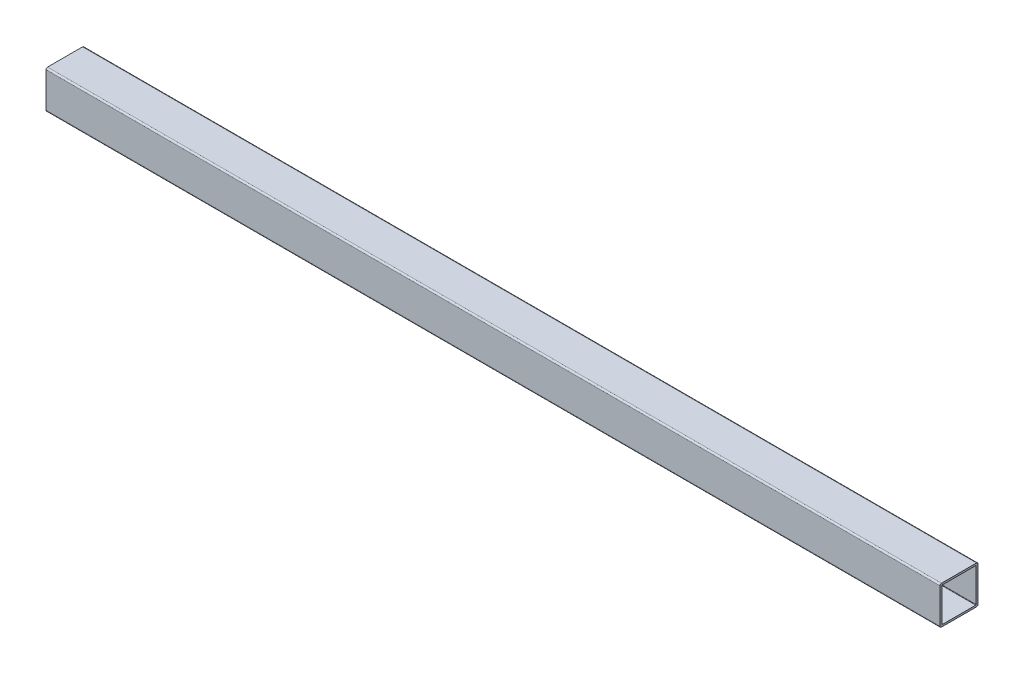
ISO-10303-21;
HEADER;
FILE_DESCRIPTION(('STEP AP214'),'2;1');
FILE_NAME('part.step','',(''),(''),'','','');
FILE_SCHEMA(('AUTOMOTIVE_DESIGN { 1 0 10303 214 1 1 1 1 }'));
ENDSEC;
DATA;
#1=APPLICATION_CONTEXT('core data for automotive mechanical design processes');
#2=APPLICATION_PROTOCOL_DEFINITION('international standard','automotive_design',2000,#1);
#3=PRODUCT_CONTEXT('',#1,'mechanical');
#4=PRODUCT('Part','Part','',(#3));
#5=PRODUCT_RELATED_PRODUCT_CATEGORY('part','',(#4));
#6=PRODUCT_DEFINITION_FORMATION('','',#4);
#7=PRODUCT_DEFINITION_CONTEXT('part definition',#1,'design');
#8=PRODUCT_DEFINITION('design','',#6,#7);
#9=PRODUCT_DEFINITION_SHAPE('','',#8);
#10=(LENGTH_UNIT() NAMED_UNIT(*) SI_UNIT(.MILLI.,.METRE.));
#11=(NAMED_UNIT(*) PLANE_ANGLE_UNIT() SI_UNIT($,.RADIAN.));
#12=(NAMED_UNIT(*) SI_UNIT($,.STERADIAN.) SOLID_ANGLE_UNIT());
#13=UNCERTAINTY_MEASURE_WITH_UNIT(LENGTH_MEASURE(1.E-05),#10,'distance_accuracy_value','');
#14=(GEOMETRIC_REPRESENTATION_CONTEXT(3) GLOBAL_UNCERTAINTY_ASSIGNED_CONTEXT((#13)) GLOBAL_UNIT_ASSIGNED_CONTEXT((#10,
#11,#12)) REPRESENTATION_CONTEXT('',''));
#15=CARTESIAN_POINT('',(0.,0.,0.));
#16=DIRECTION('',(0.,0.,1.));
#17=DIRECTION('',(1.,0.,0.));
#18=AXIS2_PLACEMENT_3D('',#15,#16,#17);
#19=CARTESIAN_POINT('',(-358.3,600.,50.));
#20=DIRECTION('',(0.,0.,1.));
#21=DIRECTION('',(1.,0.,0.));
#22=AXIS2_PLACEMENT_3D('',#19,#20,#21);
#23=PLANE('',#22);
#24=DIRECTION('',(0.,1.,0.));
#25=VECTOR('',#24,1.);
#26=CARTESIAN_POINT('',(1175.,500.,50.));
#27=LINE('',#26,#25);
#28=CARTESIAN_POINT('',(1175.,504.,50.));
#29=VERTEX_POINT('',#28);
#30=CARTESIAN_POINT('',(1175.,596.,50.));
#31=VERTEX_POINT('',#30);
#32=EDGE_CURVE('E154',#29,#31,#27,.T.);
#33=ORIENTED_EDGE('',*,*,#32,.T.);
#34=DIRECTION('',(1.,0.,0.));
#35=VECTOR('',#34,1.);
#36=CARTESIAN_POINT('',(-358.3,596.,50.));
#37=LINE('',#36,#35);
#38=CARTESIAN_POINT('',(-1175.,596.,50.));
#39=VERTEX_POINT('',#38);
#40=EDGE_CURVE('E180',#31,#39,#37,.F.);
#41=ORIENTED_EDGE('',*,*,#40,.T.);
#42=DIRECTION('',(0.,1.,0.));
#43=VECTOR('',#42,1.);
#44=CARTESIAN_POINT('',(-1175.,500.,50.));
#45=LINE('',#44,#43);
#46=CARTESIAN_POINT('',(-1175.,504.,50.));
#47=VERTEX_POINT('',#46);
#48=EDGE_CURVE('E138',#47,#39,#45,.T.);
#49=ORIENTED_EDGE('',*,*,#48,.F.);
#50=DIRECTION('',(1.,0.,0.));
#51=VECTOR('',#50,1.);
#52=CARTESIAN_POINT('',(-358.3,504.,50.));
#53=LINE('',#52,#51);
#54=EDGE_CURVE('E175',#47,#29,#53,.T.);
#55=ORIENTED_EDGE('',*,*,#54,.T.);
#56=EDGE_LOOP('',(#33,#41,#49,#55));
#57=FACE_BOUND('',#56,.T.);
#58=ADVANCED_FACE('F19',(#57),#23,.T.);
#59=CARTESIAN_POINT('',(358.3,500.,-50.0000000000001));
#60=DIRECTION('',(0.,0.,-1.));
#61=DIRECTION('',(-1.,0.,0.));
#62=AXIS2_PLACEMENT_3D('',#59,#60,#61);
#63=PLANE('',#62);
#64=DIRECTION('',(0.,1.,0.));
#65=VECTOR('',#64,1.);
#66=CARTESIAN_POINT('',(-1175.,500.,-50.0000000000001));
#67=LINE('',#66,#65);
#68=CARTESIAN_POINT('',(-1175.,596.,-50.0000000000001));
#69=VERTEX_POINT('',#68);
#70=CARTESIAN_POINT('',(-1175.,504.,-50.0000000000001));
#71=VERTEX_POINT('',#70);
#72=EDGE_CURVE('E276',#69,#71,#67,.F.);
#73=ORIENTED_EDGE('',*,*,#72,.F.);
#74=DIRECTION('',(-1.,0.,0.));
#75=VECTOR('',#74,1.);
#76=CARTESIAN_POINT('',(358.3,596.,-50.0000000000001));
#77=LINE('',#76,#75);
#78=CARTESIAN_POINT('',(1175.,596.,-50.0000000000001));
#79=VERTEX_POINT('',#78);
#80=EDGE_CURVE('E189',#69,#79,#77,.F.);
#81=ORIENTED_EDGE('',*,*,#80,.T.);
#82=DIRECTION('',(0.,1.,0.));
#83=VECTOR('',#82,1.);
#84=CARTESIAN_POINT('',(1175.,500.,-50.0000000000001));
#85=LINE('',#84,#83);
#86=CARTESIAN_POINT('',(1175.,504.,-50.0000000000001));
#87=VERTEX_POINT('',#86);
#88=EDGE_CURVE('E254',#87,#79,#85,.T.);
#89=ORIENTED_EDGE('',*,*,#88,.F.);
#90=DIRECTION('',(1.,0.,0.));
#91=VECTOR('',#90,1.);
#92=CARTESIAN_POINT('',(358.3,504.,-50.0000000000001));
#93=LINE('',#92,#91);
#94=EDGE_CURVE('E142',#87,#71,#93,.F.);
#95=ORIENTED_EDGE('',*,*,#94,.T.);
#96=EDGE_LOOP('',(#73,#81,#89,#95));
#97=FACE_BOUND('',#96,.T.);
#98=ADVANCED_FACE('F289',(#97),#63,.T.);
#99=CARTESIAN_POINT('',(1175.,100.,-825.));
#100=DIRECTION('',(-1.,0.,0.));
#101=DIRECTION('',(0.,0.,1.));
#102=AXIS2_PLACEMENT_3D('',#99,#100,#101);
#103=PLANE('',#102);
#104=DIRECTION('',(0.,0.,-1.));
#105=VECTOR('',#104,1.);
#106=CARTESIAN_POINT('',(1175.,595.,-825.));
#107=LINE('',#106,#105);
#108=CARTESIAN_POINT('',(1175.,595.,44.));
#109=VERTEX_POINT('',#108);
#110=CARTESIAN_POINT('',(1175.,595.,-44.));
#111=VERTEX_POINT('',#110);
#112=EDGE_CURVE('E250',#109,#111,#107,.T.);
#113=ORIENTED_EDGE('',*,*,#112,.T.);
#114=CARTESIAN_POINT('',(1175.,594.,-44.));
#115=DIRECTION('',(-1.,0.,0.));
#116=DIRECTION('',(0.,0.,1.));
#117=AXIS2_PLACEMENT_3D('',#114,#115,#116);
#118=CIRCLE('',#117,1.);
#119=CARTESIAN_POINT('',(1175.,594.,-45.0000000000001));
#120=VERTEX_POINT('',#119);
#121=EDGE_CURVE('E217',#111,#120,#118,.T.);
#122=ORIENTED_EDGE('',*,*,#121,.T.);
#123=DIRECTION('',(0.,-1.,0.));
#124=VECTOR('',#123,1.);
#125=CARTESIAN_POINT('',(1175.,100.,-45.));
#126=LINE('',#125,#124);
#127=CARTESIAN_POINT('',(1175.,506.,-45.0000000000001));
#128=VERTEX_POINT('',#127);
#129=EDGE_CURVE('E245',#120,#128,#126,.T.);
#130=ORIENTED_EDGE('',*,*,#129,.T.);
#131=CARTESIAN_POINT('',(1175.,506.,-44.));
#132=DIRECTION('',(-1.,0.,0.));
#133=DIRECTION('',(0.,0.,1.));
#134=AXIS2_PLACEMENT_3D('',#131,#132,#133);
#135=CIRCLE('',#134,1.);
#136=CARTESIAN_POINT('',(1175.,505.,-44.));
#137=VERTEX_POINT('',#136);
#138=EDGE_CURVE('E12',#128,#137,#135,.T.);
#139=ORIENTED_EDGE('',*,*,#138,.T.);
#140=DIRECTION('',(0.,0.,1.));
#141=VECTOR('',#140,1.);
#142=CARTESIAN_POINT('',(1175.,505.,-825.));
#143=LINE('',#142,#141);
#144=CARTESIAN_POINT('',(1175.,505.,44.));
#145=VERTEX_POINT('',#144);
#146=EDGE_CURVE('E242',#137,#145,#143,.T.);
#147=ORIENTED_EDGE('',*,*,#146,.T.);
#148=CARTESIAN_POINT('',(1175.,506.,44.));
#149=DIRECTION('',(-1.,0.,0.));
#150=DIRECTION('',(0.,0.,1.));
#151=AXIS2_PLACEMENT_3D('',#148,#149,#150);
#152=CIRCLE('',#151,1.);
#153=CARTESIAN_POINT('',(1175.,506.,45.));
#154=VERTEX_POINT('',#153);
#155=EDGE_CURVE('E225',#145,#154,#152,.T.);
#156=ORIENTED_EDGE('',*,*,#155,.T.);
#157=DIRECTION('',(0.,1.,0.));
#158=VECTOR('',#157,1.);
#159=CARTESIAN_POINT('',(1175.,100.,45.));
#160=LINE('',#159,#158);
#161=CARTESIAN_POINT('',(1175.,594.,45.));
#162=VERTEX_POINT('',#161);
#163=EDGE_CURVE('E350',#154,#162,#160,.T.);
#164=ORIENTED_EDGE('',*,*,#163,.T.);
#165=CARTESIAN_POINT('',(1175.,594.,44.));
#166=DIRECTION('',(-1.,0.,0.));
#167=DIRECTION('',(0.,0.,1.));
#168=AXIS2_PLACEMENT_3D('',#165,#166,#167);
#169=CIRCLE('',#168,1.);
#170=EDGE_CURVE('E221',#162,#109,#169,.T.);
#171=ORIENTED_EDGE('',*,*,#170,.T.);
#172=EDGE_LOOP('',(#113,#122,#130,#139,#147,#156,#164,#171));
#173=FACE_BOUND('',#172,.T.);
#174=DIRECTION('',(0.,0.,1.));
#175=VECTOR('',#174,1.);
#176=CARTESIAN_POINT('',(1175.,600.,50.));
#177=LINE('',#176,#175);
#178=CARTESIAN_POINT('',(1175.,600.,-46.0000000000001));
#179=VERTEX_POINT('',#178);
#180=CARTESIAN_POINT('',(1175.,600.,46.));
#181=VERTEX_POINT('',#180);
#182=EDGE_CURVE('E155',#179,#181,#177,.T.);
#183=ORIENTED_EDGE('',*,*,#182,.T.);
#184=CARTESIAN_POINT('',(1175.,596.,46.));
#185=DIRECTION('',(-1.,0.,0.));
#186=DIRECTION('',(0.,0.,1.));
#187=AXIS2_PLACEMENT_3D('',#184,#185,#186);
#188=CIRCLE('',#187,4.);
#189=EDGE_CURVE('E158',#181,#31,#188,.F.);
#190=ORIENTED_EDGE('',*,*,#189,.T.);
#191=ORIENTED_EDGE('',*,*,#32,.F.);
#192=CARTESIAN_POINT('',(1175.,504.,46.));
#193=DIRECTION('',(-1.,0.,0.));
#194=DIRECTION('',(0.,0.,1.));
#195=AXIS2_PLACEMENT_3D('',#192,#193,#194);
#196=CIRCLE('',#195,4.);
#197=CARTESIAN_POINT('',(1175.,500.,46.));
#198=VERTEX_POINT('',#197);
#199=EDGE_CURVE('E161',#29,#198,#196,.F.);
#200=ORIENTED_EDGE('',*,*,#199,.T.);
#201=DIRECTION('',(0.,0.,1.));
#202=VECTOR('',#201,1.);
#203=CARTESIAN_POINT('',(1175.,500.,0.));
#204=LINE('',#203,#202);
#205=CARTESIAN_POINT('',(1175.,500.,-46.));
#206=VERTEX_POINT('',#205);
#207=EDGE_CURVE('E244',#198,#206,#204,.F.);
#208=ORIENTED_EDGE('',*,*,#207,.T.);
#209=CARTESIAN_POINT('',(1175.,504.,-46.));
#210=DIRECTION('',(-1.,0.,0.));
#211=DIRECTION('',(0.,0.,1.));
#212=AXIS2_PLACEMENT_3D('',#209,#210,#211);
#213=CIRCLE('',#212,4.);
#214=EDGE_CURVE('E159',#206,#87,#213,.F.);
#215=ORIENTED_EDGE('',*,*,#214,.T.);
#216=ORIENTED_EDGE('',*,*,#88,.T.);
#217=CARTESIAN_POINT('',(1175.,596.,-46.0000000000001));
#218=DIRECTION('',(-1.,0.,0.));
#219=DIRECTION('',(0.,0.,1.));
#220=AXIS2_PLACEMENT_3D('',#217,#218,#219);
#221=CIRCLE('',#220,4.);
#222=EDGE_CURVE('E284',#79,#179,#221,.F.);
#223=ORIENTED_EDGE('',*,*,#222,.T.);
#224=EDGE_LOOP('',(#183,#190,#191,#200,#208,#215,#216,#223));
#225=FACE_BOUND('',#224,.T.);
#226=ADVANCED_FACE('F281',(#173,#225),#103,.F.);
#227=CARTESIAN_POINT('',(-1175.,100.,825.));
#228=DIRECTION('',(1.,0.,0.));
#229=DIRECTION('',(0.,0.,-1.));
#230=AXIS2_PLACEMENT_3D('',#227,#228,#229);
#231=PLANE('',#230);
#232=DIRECTION('',(0.,0.,1.));
#233=VECTOR('',#232,1.);
#234=CARTESIAN_POINT('',(-1175.,595.,825.));
#235=LINE('',#234,#233);
#236=CARTESIAN_POINT('',(-1175.,595.,-44.));
#237=VERTEX_POINT('',#236);
#238=CARTESIAN_POINT('',(-1175.,595.,44.));
#239=VERTEX_POINT('',#238);
#240=EDGE_CURVE('E239',#237,#239,#235,.T.);
#241=ORIENTED_EDGE('',*,*,#240,.T.);
#242=CARTESIAN_POINT('',(-1175.,594.,44.));
#243=DIRECTION('',(1.,0.,0.));
#244=DIRECTION('',(0.,0.,-1.));
#245=AXIS2_PLACEMENT_3D('',#242,#243,#244);
#246=CIRCLE('',#245,1.);
#247=CARTESIAN_POINT('',(-1175.,594.,45.));
#248=VERTEX_POINT('',#247);
#249=EDGE_CURVE('E219',#239,#248,#246,.T.);
#250=ORIENTED_EDGE('',*,*,#249,.T.);
#251=DIRECTION('',(0.,-1.,0.));
#252=VECTOR('',#251,1.);
#253=CARTESIAN_POINT('',(-1175.,100.,45.));
#254=LINE('',#253,#252);
#255=CARTESIAN_POINT('',(-1175.,506.,45.));
#256=VERTEX_POINT('',#255);
#257=EDGE_CURVE('E260',#248,#256,#254,.T.);
#258=ORIENTED_EDGE('',*,*,#257,.T.);
#259=CARTESIAN_POINT('',(-1175.,506.,44.));
#260=DIRECTION('',(1.,0.,0.));
#261=DIRECTION('',(0.,0.,-1.));
#262=AXIS2_PLACEMENT_3D('',#259,#260,#261);
#263=CIRCLE('',#262,1.);
#264=CARTESIAN_POINT('',(-1175.,505.,44.));
#265=VERTEX_POINT('',#264);
#266=EDGE_CURVE('E223',#256,#265,#263,.T.);
#267=ORIENTED_EDGE('',*,*,#266,.T.);
#268=DIRECTION('',(0.,0.,-1.));
#269=VECTOR('',#268,1.);
#270=CARTESIAN_POINT('',(-1175.,505.,825.));
#271=LINE('',#270,#269);
#272=CARTESIAN_POINT('',(-1175.,505.,-44.));
#273=VERTEX_POINT('',#272);
#274=EDGE_CURVE('E163',#265,#273,#271,.T.);
#275=ORIENTED_EDGE('',*,*,#274,.T.);
#276=CARTESIAN_POINT('',(-1175.,506.,-44.0000000000001));
#277=DIRECTION('',(1.,0.,0.));
#278=DIRECTION('',(0.,0.,-1.));
#279=AXIS2_PLACEMENT_3D('',#276,#277,#278);
#280=CIRCLE('',#279,1.);
#281=CARTESIAN_POINT('',(-1175.,506.,-45.0000000000001));
#282=VERTEX_POINT('',#281);
#283=EDGE_CURVE('E27',#273,#282,#280,.T.);
#284=ORIENTED_EDGE('',*,*,#283,.T.);
#285=DIRECTION('',(0.,1.,0.));
#286=VECTOR('',#285,1.);
#287=CARTESIAN_POINT('',(-1175.,99.9999999999999,-45.));
#288=LINE('',#287,#286);
#289=CARTESIAN_POINT('',(-1175.,594.,-45.0000000000001));
#290=VERTEX_POINT('',#289);
#291=EDGE_CURVE('E231',#282,#290,#288,.T.);
#292=ORIENTED_EDGE('',*,*,#291,.T.);
#293=CARTESIAN_POINT('',(-1175.,594.,-44.0000000000001));
#294=DIRECTION('',(1.,0.,0.));
#295=DIRECTION('',(0.,0.,-1.));
#296=AXIS2_PLACEMENT_3D('',#293,#294,#295);
#297=CIRCLE('',#296,1.);
#298=EDGE_CURVE('E215',#290,#237,#297,.T.);
#299=ORIENTED_EDGE('',*,*,#298,.T.);
#300=EDGE_LOOP('',(#241,#250,#258,#267,#275,#284,#292,#299));
#301=FACE_BOUND('',#300,.T.);
#302=ORIENTED_EDGE('',*,*,#48,.T.);
#303=CARTESIAN_POINT('',(-1175.,596.,46.));
#304=DIRECTION('',(1.,0.,0.));
#305=DIRECTION('',(0.,0.,-1.));
#306=AXIS2_PLACEMENT_3D('',#303,#304,#305);
#307=CIRCLE('',#306,4.);
#308=CARTESIAN_POINT('',(-1175.,600.,46.));
#309=VERTEX_POINT('',#308);
#310=EDGE_CURVE('E133',#39,#309,#307,.F.);
#311=ORIENTED_EDGE('',*,*,#310,.T.);
#312=DIRECTION('',(0.,0.,-1.));
#313=VECTOR('',#312,1.);
#314=CARTESIAN_POINT('',(-1175.,600.,50.));
#315=LINE('',#314,#313);
#316=CARTESIAN_POINT('',(-1175.,600.,-46.0000000000001));
#317=VERTEX_POINT('',#316);
#318=EDGE_CURVE('E136',#309,#317,#315,.T.);
#319=ORIENTED_EDGE('',*,*,#318,.T.);
#320=CARTESIAN_POINT('',(-1175.,596.,-46.0000000000001));
#321=DIRECTION('',(1.,0.,0.));
#322=DIRECTION('',(0.,0.,-1.));
#323=AXIS2_PLACEMENT_3D('',#320,#321,#322);
#324=CIRCLE('',#323,4.);
#325=EDGE_CURVE('E143',#317,#69,#324,.F.);
#326=ORIENTED_EDGE('',*,*,#325,.T.);
#327=ORIENTED_EDGE('',*,*,#72,.T.);
#328=CARTESIAN_POINT('',(-1175.,504.,-46.));
#329=DIRECTION('',(1.,0.,0.));
#330=DIRECTION('',(0.,0.,-1.));
#331=AXIS2_PLACEMENT_3D('',#328,#329,#330);
#332=CIRCLE('',#331,4.);
#333=CARTESIAN_POINT('',(-1175.,500.,-46.));
#334=VERTEX_POINT('',#333);
#335=EDGE_CURVE('E183',#71,#334,#332,.F.);
#336=ORIENTED_EDGE('',*,*,#335,.T.);
#337=DIRECTION('',(0.,0.,1.));
#338=VECTOR('',#337,1.);
#339=CARTESIAN_POINT('',(-1175.,500.,0.));
#340=LINE('',#339,#338);
#341=CARTESIAN_POINT('',(-1175.,500.,46.));
#342=VERTEX_POINT('',#341);
#343=EDGE_CURVE('E248',#334,#342,#340,.T.);
#344=ORIENTED_EDGE('',*,*,#343,.T.);
#345=CARTESIAN_POINT('',(-1175.,504.,46.));
#346=DIRECTION('',(1.,0.,0.));
#347=DIRECTION('',(0.,0.,-1.));
#348=AXIS2_PLACEMENT_3D('',#345,#346,#347);
#349=CIRCLE('',#348,4.);
#350=EDGE_CURVE('E185',#342,#47,#349,.F.);
#351=ORIENTED_EDGE('',*,*,#350,.T.);
#352=EDGE_LOOP('',(#302,#311,#319,#326,#327,#336,#344,#351));
#353=FACE_BOUND('',#352,.T.);
#354=ADVANCED_FACE('F135',(#301,#353),#231,.F.);
#355=CARTESIAN_POINT('',(-1275.,600.,50.));
#356=DIRECTION('',(0.,1.,0.));
#357=DIRECTION('',(0.,0.,1.));
#358=AXIS2_PLACEMENT_3D('',#355,#356,#357);
#359=PLANE('',#358);
#360=ORIENTED_EDGE('',*,*,#318,.F.);
#361=DIRECTION('',(1.,0.,0.));
#362=VECTOR('',#361,1.);
#363=CARTESIAN_POINT('',(-1275.,600.,46.));
#364=LINE('',#363,#362);
#365=EDGE_CURVE('E150',#309,#181,#364,.T.);
#366=ORIENTED_EDGE('',*,*,#365,.T.);
#367=ORIENTED_EDGE('',*,*,#182,.F.);
#368=DIRECTION('',(-1.,0.,0.));
#369=VECTOR('',#368,1.);
#370=CARTESIAN_POINT('',(-1275.,600.,-46.0000000000001));
#371=LINE('',#370,#369);
#372=EDGE_CURVE('E153',#179,#317,#371,.T.);
#373=ORIENTED_EDGE('',*,*,#372,.T.);
#374=EDGE_LOOP('',(#360,#366,#367,#373));
#375=FACE_BOUND('',#374,.T.);
#376=ADVANCED_FACE('F148',(#375),#359,.T.);
#377=CARTESIAN_POINT('',(-358.3,500.,825.));
#378=DIRECTION('',(0.,-1.,0.));
#379=DIRECTION('',(0.,0.,-1.));
#380=AXIS2_PLACEMENT_3D('',#377,#378,#379);
#381=PLANE('',#380);
#382=ORIENTED_EDGE('',*,*,#207,.F.);
#383=DIRECTION('',(1.,0.,0.));
#384=VECTOR('',#383,1.);
#385=CARTESIAN_POINT('',(-358.3,500.,46.));
#386=LINE('',#385,#384);
#387=EDGE_CURVE('E194',#198,#342,#386,.F.);
#388=ORIENTED_EDGE('',*,*,#387,.T.);
#389=ORIENTED_EDGE('',*,*,#343,.F.);
#390=DIRECTION('',(1.,0.,0.));
#391=VECTOR('',#390,1.);
#392=CARTESIAN_POINT('',(-358.3,500.,-46.));
#393=LINE('',#392,#391);
#394=EDGE_CURVE('E190',#334,#206,#393,.T.);
#395=ORIENTED_EDGE('',*,*,#394,.T.);
#396=EDGE_LOOP('',(#382,#388,#389,#395));
#397=FACE_BOUND('',#396,.T.);
#398=ADVANCED_FACE('F300',(#397),#381,.T.);
#399=CARTESIAN_POINT('',(1275.,505.,-45.));
#400=DIRECTION('',(0.,-1.,0.));
#401=DIRECTION('',(0.,0.,-1.));
#402=AXIS2_PLACEMENT_3D('',#399,#400,#401);
#403=PLANE('',#402);
#404=ORIENTED_EDGE('',*,*,#274,.F.);
#405=DIRECTION('',(-1.,0.,0.));
#406=VECTOR('',#405,1.);
#407=CARTESIAN_POINT('',(1175.,505.,44.));
#408=LINE('',#407,#406);
#409=EDGE_CURVE('E34',#265,#145,#408,.F.);
#410=ORIENTED_EDGE('',*,*,#409,.T.);
#411=ORIENTED_EDGE('',*,*,#146,.F.);
#412=DIRECTION('',(-1.,0.,0.));
#413=VECTOR('',#412,1.);
#414=CARTESIAN_POINT('',(-1175.,505.,-44.0000000000001));
#415=LINE('',#414,#413);
#416=EDGE_CURVE('E211',#137,#273,#415,.T.);
#417=ORIENTED_EDGE('',*,*,#416,.T.);
#418=EDGE_LOOP('',(#404,#410,#411,#417));
#419=FACE_BOUND('',#418,.T.);
#420=ADVANCED_FACE('F241',(#419),#403,.F.);
#421=CARTESIAN_POINT('',(1275.,595.,-45.));
#422=DIRECTION('',(0.,0.,-1.));
#423=DIRECTION('',(0.,1.,0.));
#424=AXIS2_PLACEMENT_3D('',#421,#422,#423);
#425=PLANE('',#424);
#426=ORIENTED_EDGE('',*,*,#129,.F.);
#427=DIRECTION('',(-1.,0.,0.));
#428=VECTOR('',#427,1.);
#429=CARTESIAN_POINT('',(-1175.,594.,-45.0000000000001));
#430=LINE('',#429,#428);
#431=EDGE_CURVE('E198',#120,#290,#430,.T.);
#432=ORIENTED_EDGE('',*,*,#431,.T.);
#433=ORIENTED_EDGE('',*,*,#291,.F.);
#434=DIRECTION('',(-1.,0.,0.));
#435=VECTOR('',#434,1.);
#436=CARTESIAN_POINT('',(1175.,506.,-45.));
#437=LINE('',#436,#435);
#438=EDGE_CURVE('E196',#282,#128,#437,.F.);
#439=ORIENTED_EDGE('',*,*,#438,.T.);
#440=EDGE_LOOP('',(#426,#432,#433,#439));
#441=FACE_BOUND('',#440,.T.);
#442=ADVANCED_FACE('F237',(#441),#425,.F.);
#443=CARTESIAN_POINT('',(1275.,595.,45.0000000000001));
#444=DIRECTION('',(0.,1.,0.));
#445=DIRECTION('',(0.,0.,1.));
#446=AXIS2_PLACEMENT_3D('',#443,#444,#445);
#447=PLANE('',#446);
#448=ORIENTED_EDGE('',*,*,#240,.F.);
#449=DIRECTION('',(-1.,0.,0.));
#450=VECTOR('',#449,1.);
#451=CARTESIAN_POINT('',(1175.,595.,-44.));
#452=LINE('',#451,#450);
#453=EDGE_CURVE('E204',#237,#111,#452,.F.);
#454=ORIENTED_EDGE('',*,*,#453,.T.);
#455=ORIENTED_EDGE('',*,*,#112,.F.);
#456=DIRECTION('',(-1.,0.,0.));
#457=VECTOR('',#456,1.);
#458=CARTESIAN_POINT('',(-1175.,595.,44.));
#459=LINE('',#458,#457);
#460=EDGE_CURVE('E201',#109,#239,#459,.T.);
#461=ORIENTED_EDGE('',*,*,#460,.T.);
#462=EDGE_LOOP('',(#448,#454,#455,#461));
#463=FACE_BOUND('',#462,.T.);
#464=ADVANCED_FACE('F363',(#463),#447,.F.);
#465=CARTESIAN_POINT('',(1275.,505.,45.0000000000001));
#466=DIRECTION('',(0.,0.,1.));
#467=DIRECTION('',(1.,0.,0.));
#468=AXIS2_PLACEMENT_3D('',#465,#466,#467);
#469=PLANE('',#468);
#470=ORIENTED_EDGE('',*,*,#257,.F.);
#471=DIRECTION('',(-1.,0.,0.));
#472=VECTOR('',#471,1.);
#473=CARTESIAN_POINT('',(1175.,594.,45.0000000000001));
#474=LINE('',#473,#472);
#475=EDGE_CURVE('E209',#248,#162,#474,.F.);
#476=ORIENTED_EDGE('',*,*,#475,.T.);
#477=ORIENTED_EDGE('',*,*,#163,.F.);
#478=DIRECTION('',(-1.,0.,0.));
#479=VECTOR('',#478,1.);
#480=CARTESIAN_POINT('',(-1175.,506.,45.));
#481=LINE('',#480,#479);
#482=EDGE_CURVE('E206',#154,#256,#481,.T.);
#483=ORIENTED_EDGE('',*,*,#482,.T.);
#484=EDGE_LOOP('',(#470,#476,#477,#483));
#485=FACE_BOUND('',#484,.T.);
#486=ADVANCED_FACE('F326',(#485),#469,.F.);
#487=CARTESIAN_POINT('',(-1275.,596.,46.));
#488=DIRECTION('',(1.,0.,0.));
#489=DIRECTION('',(0.,0.,-1.));
#490=AXIS2_PLACEMENT_3D('',#487,#488,#489);
#491=CYLINDRICAL_SURFACE('',#490,4.);
#492=ORIENTED_EDGE('',*,*,#310,.F.);
#493=ORIENTED_EDGE('',*,*,#40,.F.);
#494=ORIENTED_EDGE('',*,*,#189,.F.);
#495=ORIENTED_EDGE('',*,*,#365,.F.);
#496=EDGE_LOOP('',(#492,#493,#494,#495));
#497=FACE_BOUND('',#496,.T.);
#498=ADVANCED_FACE('F157',(#497),#491,.T.);
#499=CARTESIAN_POINT('',(-1275.,596.,-46.0000000000001));
#500=DIRECTION('',(-1.,0.,0.));
#501=DIRECTION('',(0.,0.,1.));
#502=AXIS2_PLACEMENT_3D('',#499,#500,#501);
#503=CYLINDRICAL_SURFACE('',#502,4.);
#504=ORIENTED_EDGE('',*,*,#222,.F.);
#505=ORIENTED_EDGE('',*,*,#80,.F.);
#506=ORIENTED_EDGE('',*,*,#325,.F.);
#507=ORIENTED_EDGE('',*,*,#372,.F.);
#508=EDGE_LOOP('',(#504,#505,#506,#507));
#509=FACE_BOUND('',#508,.T.);
#510=ADVANCED_FACE('F286',(#509),#503,.T.);
#511=CARTESIAN_POINT('',(-358.3,504.,46.));
#512=DIRECTION('',(1.,0.,0.));
#513=DIRECTION('',(0.,0.,-1.));
#514=AXIS2_PLACEMENT_3D('',#511,#512,#513);
#515=CYLINDRICAL_SURFACE('',#514,4.);
#516=ORIENTED_EDGE('',*,*,#350,.F.);
#517=ORIENTED_EDGE('',*,*,#387,.F.);
#518=ORIENTED_EDGE('',*,*,#199,.F.);
#519=ORIENTED_EDGE('',*,*,#54,.F.);
#520=EDGE_LOOP('',(#516,#517,#518,#519));
#521=FACE_BOUND('',#520,.T.);
#522=ADVANCED_FACE('F303',(#521),#515,.T.);
#523=CARTESIAN_POINT('',(-358.3,504.,-46.));
#524=DIRECTION('',(1.,0.,0.));
#525=DIRECTION('',(0.,0.,-1.));
#526=AXIS2_PLACEMENT_3D('',#523,#524,#525);
#527=CYLINDRICAL_SURFACE('',#526,4.);
#528=ORIENTED_EDGE('',*,*,#335,.F.);
#529=ORIENTED_EDGE('',*,*,#94,.F.);
#530=ORIENTED_EDGE('',*,*,#214,.F.);
#531=ORIENTED_EDGE('',*,*,#394,.F.);
#532=EDGE_LOOP('',(#528,#529,#530,#531));
#533=FACE_BOUND('',#532,.T.);
#534=ADVANCED_FACE('F293',(#533),#527,.T.);
#535=CARTESIAN_POINT('',(1275.,594.,-44.));
#536=DIRECTION('',(1.,0.,0.));
#537=DIRECTION('',(0.,0.,-1.));
#538=AXIS2_PLACEMENT_3D('',#535,#536,#537);
#539=CYLINDRICAL_SURFACE('',#538,1.);
#540=ORIENTED_EDGE('',*,*,#121,.F.);
#541=ORIENTED_EDGE('',*,*,#453,.F.);
#542=ORIENTED_EDGE('',*,*,#298,.F.);
#543=ORIENTED_EDGE('',*,*,#431,.F.);
#544=EDGE_LOOP('',(#540,#541,#542,#543));
#545=FACE_BOUND('',#544,.T.);
#546=ADVANCED_FACE('F333',(#545),#539,.F.);
#547=CARTESIAN_POINT('',(1275.,594.,44.));
#548=DIRECTION('',(1.,0.,0.));
#549=DIRECTION('',(0.,0.,-1.));
#550=AXIS2_PLACEMENT_3D('',#547,#548,#549);
#551=CYLINDRICAL_SURFACE('',#550,1.);
#552=ORIENTED_EDGE('',*,*,#170,.F.);
#553=ORIENTED_EDGE('',*,*,#475,.F.);
#554=ORIENTED_EDGE('',*,*,#249,.F.);
#555=ORIENTED_EDGE('',*,*,#460,.F.);
#556=EDGE_LOOP('',(#552,#553,#554,#555));
#557=FACE_BOUND('',#556,.T.);
#558=ADVANCED_FACE('F336',(#557),#551,.F.);
#559=CARTESIAN_POINT('',(1275.,506.,44.));
#560=DIRECTION('',(1.,0.,0.));
#561=DIRECTION('',(0.,0.,-1.));
#562=AXIS2_PLACEMENT_3D('',#559,#560,#561);
#563=CYLINDRICAL_SURFACE('',#562,1.);
#564=ORIENTED_EDGE('',*,*,#155,.F.);
#565=ORIENTED_EDGE('',*,*,#409,.F.);
#566=ORIENTED_EDGE('',*,*,#266,.F.);
#567=ORIENTED_EDGE('',*,*,#482,.F.);
#568=EDGE_LOOP('',(#564,#565,#566,#567));
#569=FACE_BOUND('',#568,.T.);
#570=ADVANCED_FACE('F339',(#569),#563,.F.);
#571=CARTESIAN_POINT('',(1275.,506.,-44.));
#572=DIRECTION('',(1.,0.,0.));
#573=DIRECTION('',(0.,0.,-1.));
#574=AXIS2_PLACEMENT_3D('',#571,#572,#573);
#575=CYLINDRICAL_SURFACE('',#574,1.);
#576=ORIENTED_EDGE('',*,*,#138,.F.);
#577=ORIENTED_EDGE('',*,*,#438,.F.);
#578=ORIENTED_EDGE('',*,*,#283,.F.);
#579=ORIENTED_EDGE('',*,*,#416,.F.);
#580=EDGE_LOOP('',(#576,#577,#578,#579));
#581=FACE_BOUND('',#580,.T.);
#582=ADVANCED_FACE('F21',(#581),#575,.F.);
#583=CLOSED_SHELL('',(#58,#98,#226,#354,#376,#398,#420,#442,#464,#486,#498,#510,#522,#534,#546,
#558,#570,#582));
#584=MANIFOLD_SOLID_BREP('B1',#583);
#585=ADVANCED_BREP_SHAPE_REPRESENTATION('',(#18,#584),#14);
#586=SHAPE_DEFINITION_REPRESENTATION(#9,#585);
ENDSEC;
END-ISO-10303-21;
